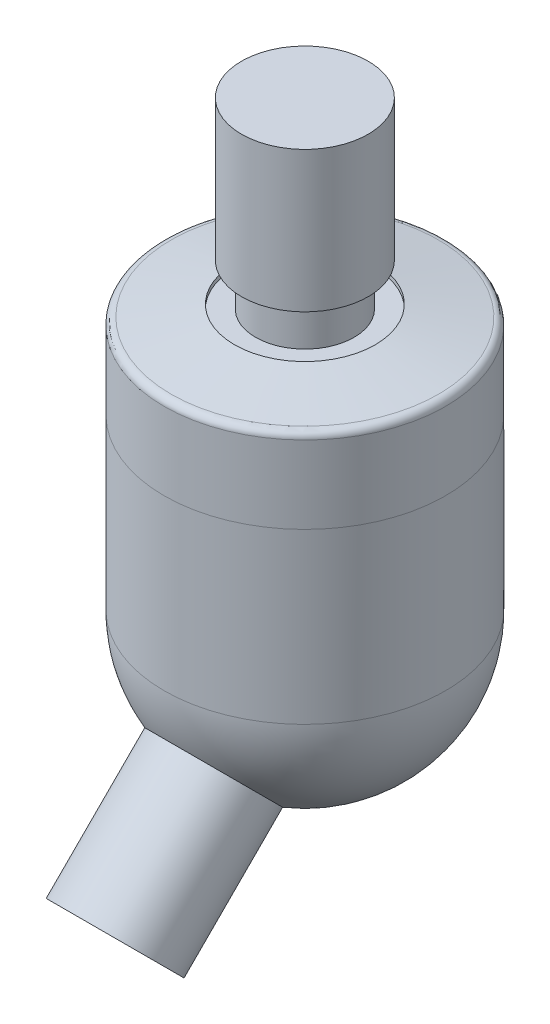
ISO-10303-21;
HEADER;
FILE_DESCRIPTION(('STEP AP214'),'2;1');
FILE_NAME('part.step','',(''),(''),'','','');
FILE_SCHEMA(('AUTOMOTIVE_DESIGN { 1 0 10303 214 1 1 1 1 }'));
ENDSEC;
DATA;
#1=APPLICATION_CONTEXT('core data for automotive mechanical design processes');
#2=APPLICATION_PROTOCOL_DEFINITION('international standard','automotive_design',2000,#1);
#3=PRODUCT_CONTEXT('',#1,'mechanical');
#4=PRODUCT('Part','Part','',(#3));
#5=PRODUCT_RELATED_PRODUCT_CATEGORY('part','',(#4));
#6=PRODUCT_DEFINITION_FORMATION('','',#4);
#7=PRODUCT_DEFINITION_CONTEXT('part definition',#1,'design');
#8=PRODUCT_DEFINITION('design','',#6,#7);
#9=PRODUCT_DEFINITION_SHAPE('','',#8);
#10=(LENGTH_UNIT() NAMED_UNIT(*) SI_UNIT(.MILLI.,.METRE.));
#11=(NAMED_UNIT(*) PLANE_ANGLE_UNIT() SI_UNIT($,.RADIAN.));
#12=(NAMED_UNIT(*) SI_UNIT($,.STERADIAN.) SOLID_ANGLE_UNIT());
#13=UNCERTAINTY_MEASURE_WITH_UNIT(LENGTH_MEASURE(1.E-05),#10,'distance_accuracy_value','');
#14=(GEOMETRIC_REPRESENTATION_CONTEXT(3) GLOBAL_UNCERTAINTY_ASSIGNED_CONTEXT((#13)) GLOBAL_UNIT_ASSIGNED_CONTEXT((#10,
#11,#12)) REPRESENTATION_CONTEXT('',''));
#15=CARTESIAN_POINT('',(0.,0.,0.));
#16=DIRECTION('',(0.,0.,1.));
#17=DIRECTION('',(1.,0.,0.));
#18=AXIS2_PLACEMENT_3D('',#15,#16,#17);
#19=CARTESIAN_POINT('',(0.,-8.14213562373095,0.));
#20=DIRECTION('',(0.,1.,0.));
#21=DIRECTION('',(0.,0.,1.));
#22=AXIS2_PLACEMENT_3D('',#19,#20,#21);
#23=CYLINDRICAL_SURFACE('',#22,5.);
#24=CARTESIAN_POINT('',(0.,8.75,0.));
#25=DIRECTION('',(0.,1.,0.));
#26=DIRECTION('',(0.,0.,1.));
#27=AXIS2_PLACEMENT_3D('',#24,#25,#26);
#28=CIRCLE('',#27,5.);
#29=CARTESIAN_POINT('',(0.,8.75,5.));
#30=VERTEX_POINT('',#29);
#31=EDGE_CURVE('E11',#30,#30,#28,.F.);
#32=ORIENTED_EDGE('',*,*,#31,.T.);
#33=EDGE_LOOP('',(#32));
#34=FACE_BOUND('',#33,.T.);
#35=CARTESIAN_POINT('',(0.,6.,0.));
#36=DIRECTION('',(0.,1.,0.));
#37=DIRECTION('',(0.,0.,1.));
#38=AXIS2_PLACEMENT_3D('',#35,#36,#37);
#39=CIRCLE('',#38,5.);
#40=CARTESIAN_POINT('',(0.,6.,5.));
#41=VERTEX_POINT('',#40);
#42=EDGE_CURVE('E55',#41,#41,#39,.F.);
#43=ORIENTED_EDGE('',*,*,#42,.F.);
#44=EDGE_LOOP('',(#43));
#45=FACE_BOUND('',#44,.T.);
#46=ADVANCED_FACE('F43',(#34,#45),#23,.T.);
#47=CARTESIAN_POINT('',(0.,6.,0.));
#48=DIRECTION('',(0.,1.,0.));
#49=DIRECTION('',(0.,0.,1.));
#50=AXIS2_PLACEMENT_3D('',#47,#48,#49);
#51=PLANE('',#50);
#52=ORIENTED_EDGE('',*,*,#42,.T.);
#53=EDGE_LOOP('',(#52));
#54=FACE_BOUND('',#53,.T.);
#55=ADVANCED_FACE('F94',(#54),#51,.F.);
#56=CARTESIAN_POINT('',(0.,8.75,0.));
#57=DIRECTION('',(0.,1.,0.));
#58=DIRECTION('',(0.,0.,1.));
#59=AXIS2_PLACEMENT_3D('',#56,#57,#58);
#60=TOROIDAL_SURFACE('',#59,4.75,0.25);
#61=ORIENTED_EDGE('',*,*,#31,.F.);
#62=EDGE_LOOP('',(#61));
#63=FACE_BOUND('',#62,.T.);
#64=CARTESIAN_POINT('',(0.,9.,0.));
#65=DIRECTION('',(0.,1.,0.));
#66=DIRECTION('',(0.,0.,1.));
#67=AXIS2_PLACEMENT_3D('',#64,#65,#66);
#68=CIRCLE('',#67,4.75);
#69=CARTESIAN_POINT('',(0.,9.,4.75));
#70=VERTEX_POINT('',#69);
#71=EDGE_CURVE('E51',#70,#70,#68,.T.);
#72=ORIENTED_EDGE('',*,*,#71,.F.);
#73=EDGE_LOOP('',(#72));
#74=FACE_BOUND('',#73,.T.);
#75=ADVANCED_FACE('F45',(#63,#74),#60,.T.);
#76=CARTESIAN_POINT('',(0.,9.,0.));
#77=DIRECTION('',(0.,-1.,0.));
#78=DIRECTION('',(0.,0.,1.));
#79=AXIS2_PLACEMENT_3D('',#76,#77,#78);
#80=CONICAL_SURFACE('',#79,4.75,1.39626340159547);
#81=CARTESIAN_POINT('',(0.,9.39673570659404,0.));
#82=DIRECTION('',(0.,-1.,0.));
#83=DIRECTION('',(0.,0.,-1.));
#84=AXIS2_PLACEMENT_3D('',#81,#82,#83);
#85=CIRCLE('',#84,2.5);
#86=CARTESIAN_POINT('',(0.,9.39673570659404,-2.5));
#87=VERTEX_POINT('',#86);
#88=EDGE_CURVE('E47',#87,#87,#85,.T.);
#89=ORIENTED_EDGE('',*,*,#88,.T.);
#90=EDGE_LOOP('',(#89));
#91=FACE_BOUND('',#90,.T.);
#92=ORIENTED_EDGE('',*,*,#71,.T.);
#93=EDGE_LOOP('',(#92));
#94=FACE_BOUND('',#93,.T.);
#95=ADVANCED_FACE('F102',(#91,#94),#80,.T.);
#96=CARTESIAN_POINT('',(0.,9.25,0.));
#97=DIRECTION('',(0.,1.,0.));
#98=DIRECTION('',(0.,0.,1.));
#99=AXIS2_PLACEMENT_3D('',#96,#97,#98);
#100=CYLINDRICAL_SURFACE('',#99,2.5);
#101=CARTESIAN_POINT('',(0.,9.25,0.));
#102=DIRECTION('',(0.,1.,0.));
#103=DIRECTION('',(0.,0.,1.));
#104=AXIS2_PLACEMENT_3D('',#101,#102,#103);
#105=CIRCLE('',#104,2.5);
#106=CARTESIAN_POINT('',(0.,9.25,2.5));
#107=VERTEX_POINT('',#106);
#108=EDGE_CURVE('E60',#107,#107,#105,.T.);
#109=ORIENTED_EDGE('',*,*,#108,.F.);
#110=EDGE_LOOP('',(#109));
#111=FACE_BOUND('',#110,.T.);
#112=ORIENTED_EDGE('',*,*,#88,.F.);
#113=EDGE_LOOP('',(#112));
#114=FACE_BOUND('',#113,.T.);
#115=ADVANCED_FACE('F105',(#111,#114),#100,.F.);
#116=CARTESIAN_POINT('',(0.,9.25,0.));
#117=DIRECTION('',(0.,1.,0.));
#118=DIRECTION('',(0.,0.,1.));
#119=AXIS2_PLACEMENT_3D('',#116,#117,#118);
#120=PLANE('',#119);
#121=CARTESIAN_POINT('',(0.,9.25,0.));
#122=DIRECTION('',(0.,1.,0.));
#123=DIRECTION('',(0.,0.,1.));
#124=AXIS2_PLACEMENT_3D('',#121,#122,#123);
#125=CIRCLE('',#124,1.75);
#126=CARTESIAN_POINT('',(0.,9.25,1.75));
#127=VERTEX_POINT('',#126);
#128=EDGE_CURVE('E64',#127,#127,#125,.T.);
#129=ORIENTED_EDGE('',*,*,#128,.F.);
#130=EDGE_LOOP('',(#129));
#131=FACE_BOUND('',#130,.T.);
#132=ORIENTED_EDGE('',*,*,#108,.T.);
#133=EDGE_LOOP('',(#132));
#134=FACE_BOUND('',#133,.T.);
#135=ADVANCED_FACE('F109',(#131,#134),#120,.T.);
#136=CARTESIAN_POINT('',(0.,10.75,0.));
#137=DIRECTION('',(0.,-1.,0.));
#138=DIRECTION('',(0.,0.,-1.));
#139=AXIS2_PLACEMENT_3D('',#136,#137,#138);
#140=CYLINDRICAL_SURFACE('',#139,1.75);
#141=CARTESIAN_POINT('',(0.,10.75,0.));
#142=DIRECTION('',(0.,1.,0.));
#143=DIRECTION('',(0.,0.,1.));
#144=AXIS2_PLACEMENT_3D('',#141,#142,#143);
#145=CIRCLE('',#144,1.75);
#146=CARTESIAN_POINT('',(0.,10.75,1.75));
#147=VERTEX_POINT('',#146);
#148=EDGE_CURVE('E63',#147,#147,#145,.T.);
#149=ORIENTED_EDGE('',*,*,#148,.F.);
#150=EDGE_LOOP('',(#149));
#151=FACE_BOUND('',#150,.T.);
#152=ORIENTED_EDGE('',*,*,#128,.T.);
#153=EDGE_LOOP('',(#152));
#154=FACE_BOUND('',#153,.T.);
#155=ADVANCED_FACE('F81',(#151,#154),#140,.T.);
#156=CARTESIAN_POINT('',(0.,15.75,0.));
#157=DIRECTION('',(0.,-1.,0.));
#158=DIRECTION('',(0.,0.,-1.));
#159=AXIS2_PLACEMENT_3D('',#156,#157,#158);
#160=CYLINDRICAL_SURFACE('',#159,2.25);
#161=CARTESIAN_POINT('',(0.,15.75,0.));
#162=DIRECTION('',(0.,1.,0.));
#163=DIRECTION('',(0.,0.,1.));
#164=AXIS2_PLACEMENT_3D('',#161,#162,#163);
#165=CIRCLE('',#164,2.25);
#166=CARTESIAN_POINT('',(0.,15.75,2.25));
#167=VERTEX_POINT('',#166);
#168=EDGE_CURVE('E67',#167,#167,#165,.T.);
#169=ORIENTED_EDGE('',*,*,#168,.F.);
#170=EDGE_LOOP('',(#169));
#171=FACE_BOUND('',#170,.T.);
#172=CARTESIAN_POINT('',(0.,10.75,0.));
#173=DIRECTION('',(0.,1.,0.));
#174=DIRECTION('',(0.,0.,1.));
#175=AXIS2_PLACEMENT_3D('',#172,#173,#174);
#176=CIRCLE('',#175,2.25);
#177=CARTESIAN_POINT('',(0.,10.75,2.25));
#178=VERTEX_POINT('',#177);
#179=EDGE_CURVE('E70',#178,#178,#176,.T.);
#180=ORIENTED_EDGE('',*,*,#179,.T.);
#181=EDGE_LOOP('',(#180));
#182=FACE_BOUND('',#181,.T.);
#183=ADVANCED_FACE('F78',(#171,#182),#160,.T.);
#184=CARTESIAN_POINT('',(0.,15.75,0.));
#185=DIRECTION('',(0.,1.,0.));
#186=DIRECTION('',(0.,0.,1.));
#187=AXIS2_PLACEMENT_3D('',#184,#185,#186);
#188=PLANE('',#187);
#189=ORIENTED_EDGE('',*,*,#168,.T.);
#190=EDGE_LOOP('',(#189));
#191=FACE_BOUND('',#190,.T.);
#192=ADVANCED_FACE('F76',(#191),#188,.T.);
#193=CARTESIAN_POINT('',(0.,10.75,0.));
#194=DIRECTION('',(0.,1.,0.));
#195=DIRECTION('',(0.,0.,1.));
#196=AXIS2_PLACEMENT_3D('',#193,#194,#195);
#197=PLANE('',#196);
#198=ORIENTED_EDGE('',*,*,#148,.T.);
#199=EDGE_LOOP('',(#198));
#200=FACE_BOUND('',#199,.T.);
#201=ORIENTED_EDGE('',*,*,#179,.F.);
#202=EDGE_LOOP('',(#201));
#203=FACE_BOUND('',#202,.T.);
#204=ADVANCED_FACE('F85',(#200,#203),#197,.F.);
#205=CLOSED_SHELL('',(#46,#55,#75,#95,#115,#135,#155,#183,#192,#204));
#206=MANIFOLD_SOLID_BREP('B2',#205);
#207=CARTESIAN_POINT('',(0.,0.,0.));
#208=DIRECTION('',(0.,0.,1.));
#209=DIRECTION('',(1.,0.,0.));
#210=AXIS2_PLACEMENT_3D('',#207,#208,#209);
#211=SPHERICAL_SURFACE('',#210,5.);
#212=CARTESIAN_POINT('',(0.,0.,0.));
#213=DIRECTION('',(0.,1.,0.));
#214=DIRECTION('',(0.,0.,1.));
#215=AXIS2_PLACEMENT_3D('',#212,#213,#214);
#216=CIRCLE('',#215,5.);
#217=CARTESIAN_POINT('',(0.,0.,5.));
#218=VERTEX_POINT('',#217);
#219=EDGE_CURVE('E214',#218,#218,#216,.T.);
#220=ORIENTED_EDGE('',*,*,#219,.F.);
#221=EDGE_LOOP('',(#220));
#222=FACE_BOUND('',#221,.T.);
#223=CARTESIAN_POINT('',(0.,-3.24037034920393,3.24037034920393));
#224=DIRECTION('',(0.,0.707106781186547,-0.707106781186548));
#225=DIRECTION('',(0.,0.707106781186548,0.707106781186547));
#226=AXIS2_PLACEMENT_3D('',#223,#224,#225);
#227=CIRCLE('',#226,2.);
#228=CARTESIAN_POINT('',(0.,-1.82615678683083,4.65458391157703));
#229=VERTEX_POINT('',#228);
#230=EDGE_CURVE('E42',#229,#229,#227,.F.);
#231=ORIENTED_EDGE('',*,*,#230,.F.);
#232=EDGE_LOOP('',(#231));
#233=FACE_BOUND('',#232,.T.);
#234=ADVANCED_FACE('F203',(#222,#233),#211,.T.);
#235=CARTESIAN_POINT('',(0.,6.,0.));
#236=DIRECTION('',(0.,-1.,0.));
#237=DIRECTION('',(0.,0.,-1.));
#238=AXIS2_PLACEMENT_3D('',#235,#236,#237);
#239=CYLINDRICAL_SURFACE('',#238,5.);
#240=CARTESIAN_POINT('',(0.,6.,0.));
#241=DIRECTION('',(0.,1.,0.));
#242=DIRECTION('',(0.,0.,1.));
#243=AXIS2_PLACEMENT_3D('',#240,#241,#242);
#244=CIRCLE('',#243,5.);
#245=CARTESIAN_POINT('',(0.,6.,5.));
#246=VERTEX_POINT('',#245);
#247=EDGE_CURVE('E210',#246,#246,#244,.T.);
#248=ORIENTED_EDGE('',*,*,#247,.F.);
#249=EDGE_LOOP('',(#248));
#250=FACE_BOUND('',#249,.T.);
#251=ORIENTED_EDGE('',*,*,#219,.T.);
#252=EDGE_LOOP('',(#251));
#253=FACE_BOUND('',#252,.T.);
#254=ADVANCED_FACE('F248',(#250,#253),#239,.T.);
#255=CARTESIAN_POINT('',(0.,6.,0.));
#256=DIRECTION('',(0.,1.,0.));
#257=DIRECTION('',(0.,0.,1.));
#258=AXIS2_PLACEMENT_3D('',#255,#256,#257);
#259=PLANE('',#258);
#260=ORIENTED_EDGE('',*,*,#247,.T.);
#261=EDGE_LOOP('',(#260));
#262=FACE_BOUND('',#261,.T.);
#263=ADVANCED_FACE('F253',(#262),#259,.T.);
#264=CARTESIAN_POINT('',(0.,-6.74264068711928,6.74264068711929));
#265=DIRECTION('',(0.,0.707106781186547,-0.707106781186548));
#266=DIRECTION('',(0.,0.707106781186548,0.707106781186547));
#267=AXIS2_PLACEMENT_3D('',#264,#265,#266);
#268=CYLINDRICAL_SURFACE('',#267,2.);
#269=CARTESIAN_POINT('',(0.,-6.74264068711928,6.74264068711929));
#270=DIRECTION('',(0.,-0.707106781186547,0.707106781186548));
#271=DIRECTION('',(0.,-0.707106781186548,-0.707106781186547));
#272=AXIS2_PLACEMENT_3D('',#269,#270,#271);
#273=CIRCLE('',#272,2.);
#274=CARTESIAN_POINT('',(0.,-8.15685424949238,5.32842712474619));
#275=VERTEX_POINT('',#274);
#276=EDGE_CURVE('E222',#275,#275,#273,.T.);
#277=ORIENTED_EDGE('',*,*,#276,.F.);
#278=EDGE_LOOP('',(#277));
#279=FACE_BOUND('',#278,.T.);
#280=ORIENTED_EDGE('',*,*,#230,.T.);
#281=EDGE_LOOP('',(#280));
#282=FACE_BOUND('',#281,.T.);
#283=ADVANCED_FACE('F244',(#279,#282),#268,.T.);
#284=CARTESIAN_POINT('',(0.,-6.74264068711928,6.74264068711929));
#285=DIRECTION('',(0.,0.707106781186547,-0.707106781186548));
#286=DIRECTION('',(0.,0.707106781186548,0.707106781186547));
#287=AXIS2_PLACEMENT_3D('',#284,#285,#286);
#288=CYLINDRICAL_SURFACE('',#287,1.);
#289=CARTESIAN_POINT('',(0.,-6.74264068711928,6.74264068711929));
#290=DIRECTION('',(0.,-0.707106781186547,0.707106781186548));
#291=DIRECTION('',(0.,-0.707106781186548,-0.707106781186547));
#292=AXIS2_PLACEMENT_3D('',#289,#290,#291);
#293=CIRCLE('',#292,1.);
#294=CARTESIAN_POINT('',(0.,-7.44974746830583,6.03553390593274));
#295=VERTEX_POINT('',#294);
#296=EDGE_CURVE('E228',#295,#295,#293,.T.);
#297=ORIENTED_EDGE('',*,*,#296,.T.);
#298=EDGE_LOOP('',(#297));
#299=FACE_BOUND('',#298,.T.);
#300=CARTESIAN_POINT('',(0.,-3.46410161513775,3.46410161513776));
#301=DIRECTION('',(0.,0.707106781186547,-0.707106781186548));
#302=DIRECTION('',(0.,0.707106781186548,0.707106781186547));
#303=AXIS2_PLACEMENT_3D('',#300,#301,#302);
#304=CIRCLE('',#303,1.);
#305=CARTESIAN_POINT('',(0.,-2.75699483395121,4.1712083963243));
#306=VERTEX_POINT('',#305);
#307=EDGE_CURVE('E219',#306,#306,#304,.F.);
#308=ORIENTED_EDGE('',*,*,#307,.F.);
#309=EDGE_LOOP('',(#308));
#310=FACE_BOUND('',#309,.T.);
#311=ADVANCED_FACE('F234',(#299,#310),#288,.F.);
#312=CARTESIAN_POINT('',(0.,-6.74264068711928,6.74264068711929));
#313=DIRECTION('',(0.,-0.707106781186547,0.707106781186548));
#314=DIRECTION('',(0.,-0.707106781186548,-0.707106781186547));
#315=AXIS2_PLACEMENT_3D('',#312,#313,#314);
#316=PLANE('',#315);
#317=ORIENTED_EDGE('',*,*,#276,.T.);
#318=EDGE_LOOP('',(#317));
#319=FACE_BOUND('',#318,.T.);
#320=ORIENTED_EDGE('',*,*,#296,.F.);
#321=EDGE_LOOP('',(#320));
#322=FACE_BOUND('',#321,.T.);
#323=ADVANCED_FACE('F237',(#319,#322),#316,.T.);
#324=CARTESIAN_POINT('',(0.,0.,0.));
#325=DIRECTION('',(0.,0.707106781186547,-0.707106781186548));
#326=DIRECTION('',(0.,0.707106781186548,0.707106781186547));
#327=AXIS2_PLACEMENT_3D('',#324,#325,#326);
#328=SPHERICAL_SURFACE('',#327,5.);
#329=ORIENTED_EDGE('',*,*,#307,.T.);
#330=EDGE_LOOP('',(#329));
#331=FACE_BOUND('',#330,.T.);
#332=ADVANCED_FACE('F205',(#331),#328,.T.);
#333=CLOSED_SHELL('',(#234,#254,#263,#283,#311,#323,#332));
#334=MANIFOLD_SOLID_BREP('B6',#333);
#335=ADVANCED_BREP_SHAPE_REPRESENTATION('',(#18,#206,#334),#14);
#336=SHAPE_DEFINITION_REPRESENTATION(#9,#335);
ENDSEC;
END-ISO-10303-21;
